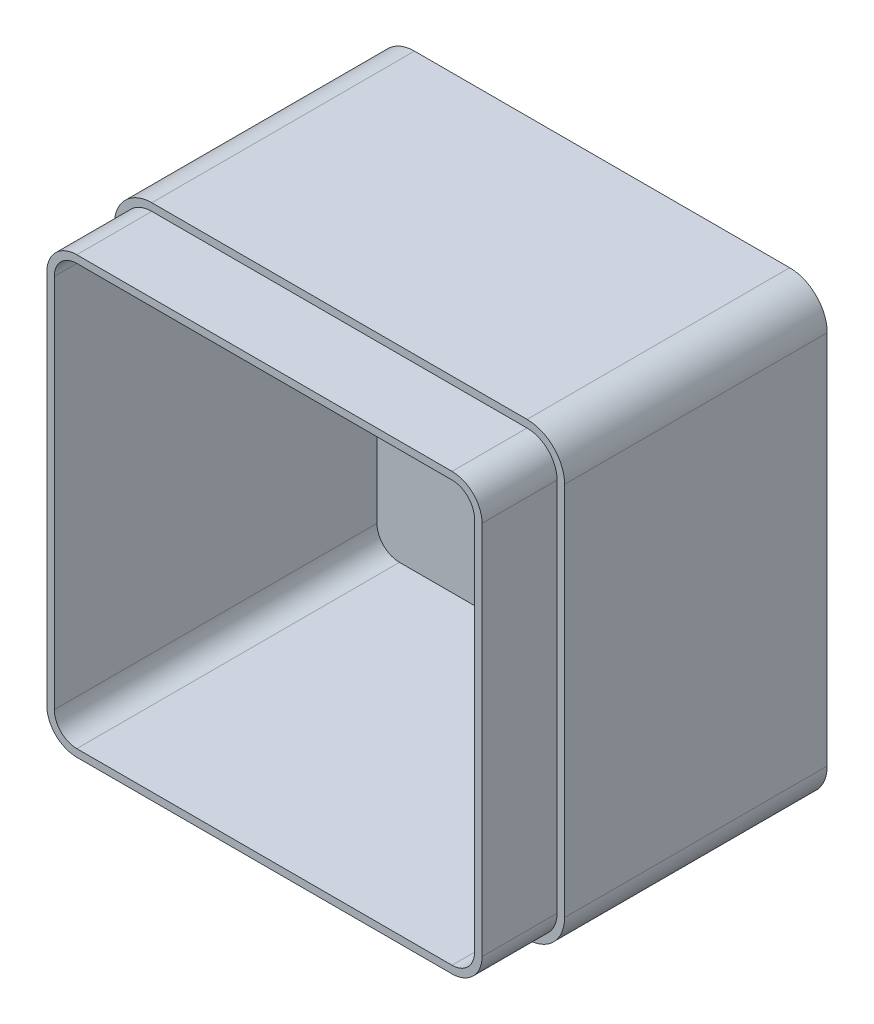
ISO-10303-21;
HEADER;
FILE_DESCRIPTION(('STEP AP214'),'2;1');
FILE_NAME('part.step','',(''),(''),'','','');
FILE_SCHEMA(('AUTOMOTIVE_DESIGN { 1 0 10303 214 1 1 1 1 }'));
ENDSEC;
DATA;
#1=APPLICATION_CONTEXT('core data for automotive mechanical design processes');
#2=APPLICATION_PROTOCOL_DEFINITION('international standard','automotive_design',2000,#1);
#3=PRODUCT_CONTEXT('',#1,'mechanical');
#4=PRODUCT('Part','Part','',(#3));
#5=PRODUCT_RELATED_PRODUCT_CATEGORY('part','',(#4));
#6=PRODUCT_DEFINITION_FORMATION('','',#4);
#7=PRODUCT_DEFINITION_CONTEXT('part definition',#1,'design');
#8=PRODUCT_DEFINITION('design','',#6,#7);
#9=PRODUCT_DEFINITION_SHAPE('','',#8);
#10=(LENGTH_UNIT() NAMED_UNIT(*) SI_UNIT(.MILLI.,.METRE.));
#11=(NAMED_UNIT(*) PLANE_ANGLE_UNIT() SI_UNIT($,.RADIAN.));
#12=(NAMED_UNIT(*) SI_UNIT($,.STERADIAN.) SOLID_ANGLE_UNIT());
#13=UNCERTAINTY_MEASURE_WITH_UNIT(LENGTH_MEASURE(1.E-05),#10,'distance_accuracy_value','');
#14=(GEOMETRIC_REPRESENTATION_CONTEXT(3) GLOBAL_UNCERTAINTY_ASSIGNED_CONTEXT((#13)) GLOBAL_UNIT_ASSIGNED_CONTEXT((#10,
#11,#12)) REPRESENTATION_CONTEXT('',''));
#15=CARTESIAN_POINT('',(0.,0.,0.));
#16=DIRECTION('',(0.,0.,1.));
#17=DIRECTION('',(1.,0.,0.));
#18=AXIS2_PLACEMENT_3D('',#15,#16,#17);
#19=CARTESIAN_POINT('',(0.,0.,90.));
#20=DIRECTION('',(0.,0.,-1.));
#21=DIRECTION('',(-1.,0.,0.));
#22=AXIS2_PLACEMENT_3D('',#19,#20,#21);
#23=PLANE('',#22);
#24=DIRECTION('',(0.,-1.,0.));
#25=VECTOR('',#24,1.);
#26=CARTESIAN_POINT('',(4.,0.,90.));
#27=LINE('',#26,#25);
#28=CARTESIAN_POINT('',(3.99999999999996,110.,90.));
#29=VERTEX_POINT('',#28);
#30=CARTESIAN_POINT('',(4.,10.,90.));
#31=VERTEX_POINT('',#30);
#32=EDGE_CURVE('E306',#29,#31,#27,.T.);
#33=ORIENTED_EDGE('',*,*,#32,.F.);
#34=CARTESIAN_POINT('',(9.99999999999996,110.,90.));
#35=DIRECTION('',(0.,0.,-1.));
#36=DIRECTION('',(-1.,0.,0.));
#37=AXIS2_PLACEMENT_3D('',#34,#35,#36);
#38=CIRCLE('',#37,6.);
#39=CARTESIAN_POINT('',(9.99999999999996,116.,90.));
#40=VERTEX_POINT('',#39);
#41=EDGE_CURVE('E289',#40,#29,#38,.F.);
#42=ORIENTED_EDGE('',*,*,#41,.F.);
#43=DIRECTION('',(-1.,0.,0.));
#44=VECTOR('',#43,1.);
#45=CARTESIAN_POINT('',(0.,116.,90.));
#46=LINE('',#45,#44);
#47=CARTESIAN_POINT('',(110.,116.,90.));
#48=VERTEX_POINT('',#47);
#49=EDGE_CURVE('E315',#48,#40,#46,.T.);
#50=ORIENTED_EDGE('',*,*,#49,.F.);
#51=CARTESIAN_POINT('',(110.,110.,90.));
#52=DIRECTION('',(0.,0.,-1.));
#53=DIRECTION('',(-1.,0.,0.));
#54=AXIS2_PLACEMENT_3D('',#51,#52,#53);
#55=CIRCLE('',#54,6.);
#56=CARTESIAN_POINT('',(116.,110.,90.));
#57=VERTEX_POINT('',#56);
#58=EDGE_CURVE('E338',#57,#48,#55,.F.);
#59=ORIENTED_EDGE('',*,*,#58,.F.);
#60=DIRECTION('',(0.,1.,0.));
#61=VECTOR('',#60,1.);
#62=CARTESIAN_POINT('',(116.,0.,90.));
#63=LINE('',#62,#61);
#64=CARTESIAN_POINT('',(116.,10.,90.));
#65=VERTEX_POINT('',#64);
#66=EDGE_CURVE('E336',#65,#57,#63,.T.);
#67=ORIENTED_EDGE('',*,*,#66,.F.);
#68=CARTESIAN_POINT('',(110.,10.,90.));
#69=DIRECTION('',(0.,0.,-1.));
#70=DIRECTION('',(-1.,0.,0.));
#71=AXIS2_PLACEMENT_3D('',#68,#69,#70);
#72=CIRCLE('',#71,6.);
#73=CARTESIAN_POINT('',(110.,4.,90.));
#74=VERTEX_POINT('',#73);
#75=EDGE_CURVE('E333',#74,#65,#72,.F.);
#76=ORIENTED_EDGE('',*,*,#75,.F.);
#77=DIRECTION('',(1.,0.,0.));
#78=VECTOR('',#77,1.);
#79=CARTESIAN_POINT('',(0.,4.,90.));
#80=LINE('',#79,#78);
#81=CARTESIAN_POINT('',(9.99999999999999,4.,90.));
#82=VERTEX_POINT('',#81);
#83=EDGE_CURVE('E331',#82,#74,#80,.T.);
#84=ORIENTED_EDGE('',*,*,#83,.F.);
#85=CARTESIAN_POINT('',(9.99999999999999,10.,90.));
#86=DIRECTION('',(0.,0.,-1.));
#87=DIRECTION('',(-1.,0.,0.));
#88=AXIS2_PLACEMENT_3D('',#85,#86,#87);
#89=CIRCLE('',#88,6.);
#90=EDGE_CURVE('E322',#31,#82,#89,.F.);
#91=ORIENTED_EDGE('',*,*,#90,.F.);
#92=EDGE_LOOP('',(#33,#42,#50,#59,#67,#76,#84,#91));
#93=FACE_BOUND('',#92,.T.);
#94=CARTESIAN_POINT('',(9.99999999999996,110.,90.));
#95=DIRECTION('',(0.,0.,1.));
#96=DIRECTION('',(1.,0.,0.));
#97=AXIS2_PLACEMENT_3D('',#94,#95,#96);
#98=CIRCLE('',#97,8.);
#99=CARTESIAN_POINT('',(9.99999999999995,118.,90.));
#100=VERTEX_POINT('',#99);
#101=CARTESIAN_POINT('',(1.99999999999996,110.,90.));
#102=VERTEX_POINT('',#101);
#103=EDGE_CURVE('E241',#100,#102,#98,.T.);
#104=ORIENTED_EDGE('',*,*,#103,.T.);
#105=DIRECTION('',(0.,-1.,0.));
#106=VECTOR('',#105,1.);
#107=CARTESIAN_POINT('',(1.99999999999996,110.,90.));
#108=LINE('',#107,#106);
#109=CARTESIAN_POINT('',(1.99999999999996,9.99999999999999,90.));
#110=VERTEX_POINT('',#109);
#111=EDGE_CURVE('E201',#102,#110,#108,.T.);
#112=ORIENTED_EDGE('',*,*,#111,.T.);
#113=CARTESIAN_POINT('',(9.99999999999999,10.,90.));
#114=DIRECTION('',(0.,0.,1.));
#115=DIRECTION('',(1.,0.,0.));
#116=AXIS2_PLACEMENT_3D('',#113,#114,#115);
#117=CIRCLE('',#116,8.00000000000001);
#118=CARTESIAN_POINT('',(9.99999999999999,1.99999999999998,90.));
#119=VERTEX_POINT('',#118);
#120=EDGE_CURVE('E50',#110,#119,#117,.T.);
#121=ORIENTED_EDGE('',*,*,#120,.T.);
#122=DIRECTION('',(1.,0.,0.));
#123=VECTOR('',#122,1.);
#124=CARTESIAN_POINT('',(9.99999999999999,2.,90.));
#125=LINE('',#124,#123);
#126=CARTESIAN_POINT('',(110.,2.,90.));
#127=VERTEX_POINT('',#126);
#128=EDGE_CURVE('E245',#119,#127,#125,.T.);
#129=ORIENTED_EDGE('',*,*,#128,.T.);
#130=CARTESIAN_POINT('',(110.,10.,90.));
#131=DIRECTION('',(0.,0.,1.));
#132=DIRECTION('',(1.,0.,0.));
#133=AXIS2_PLACEMENT_3D('',#130,#131,#132);
#134=CIRCLE('',#133,7.99999999999999);
#135=CARTESIAN_POINT('',(118.,10.,90.));
#136=VERTEX_POINT('',#135);
#137=EDGE_CURVE('E248',#127,#136,#134,.T.);
#138=ORIENTED_EDGE('',*,*,#137,.T.);
#139=DIRECTION('',(0.,1.,0.));
#140=VECTOR('',#139,1.);
#141=CARTESIAN_POINT('',(118.,9.99999999999999,90.));
#142=LINE('',#141,#140);
#143=CARTESIAN_POINT('',(118.,110.,90.));
#144=VERTEX_POINT('',#143);
#145=EDGE_CURVE('E251',#136,#144,#142,.T.);
#146=ORIENTED_EDGE('',*,*,#145,.T.);
#147=CARTESIAN_POINT('',(110.,110.,90.));
#148=DIRECTION('',(0.,0.,1.));
#149=DIRECTION('',(1.,0.,0.));
#150=AXIS2_PLACEMENT_3D('',#147,#148,#149);
#151=CIRCLE('',#150,8.00000000000001);
#152=CARTESIAN_POINT('',(110.,118.,90.));
#153=VERTEX_POINT('',#152);
#154=EDGE_CURVE('E224',#144,#153,#151,.T.);
#155=ORIENTED_EDGE('',*,*,#154,.T.);
#156=DIRECTION('',(-1.,0.,0.));
#157=VECTOR('',#156,1.);
#158=CARTESIAN_POINT('',(110.,118.,90.));
#159=LINE('',#158,#157);
#160=EDGE_CURVE('E221',#153,#100,#159,.T.);
#161=ORIENTED_EDGE('',*,*,#160,.T.);
#162=EDGE_LOOP('',(#104,#112,#121,#129,#138,#146,#155,#161));
#163=FACE_BOUND('',#162,.T.);
#164=ADVANCED_FACE('F35',(#93,#163),#23,.F.);
#165=CARTESIAN_POINT('',(4.,0.,90.));
#166=DIRECTION('',(1.,0.,0.));
#167=DIRECTION('',(0.,1.,0.));
#168=AXIS2_PLACEMENT_3D('',#165,#166,#167);
#169=PLANE('',#168);
#170=DIRECTION('',(0.,-1.,0.));
#171=VECTOR('',#170,1.);
#172=CARTESIAN_POINT('',(4.,0.,4.));
#173=LINE('',#172,#171);
#174=CARTESIAN_POINT('',(3.99999999999996,110.,4.));
#175=VERTEX_POINT('',#174);
#176=CARTESIAN_POINT('',(4.,10.,4.));
#177=VERTEX_POINT('',#176);
#178=EDGE_CURVE('E283',#175,#177,#173,.T.);
#179=ORIENTED_EDGE('',*,*,#178,.F.);
#180=DIRECTION('',(0.,0.,1.));
#181=VECTOR('',#180,1.);
#182=CARTESIAN_POINT('',(3.99999999999996,110.,90.));
#183=LINE('',#182,#181);
#184=EDGE_CURVE('E290',#29,#175,#183,.F.);
#185=ORIENTED_EDGE('',*,*,#184,.F.);
#186=ORIENTED_EDGE('',*,*,#32,.T.);
#187=DIRECTION('',(0.,0.,1.));
#188=VECTOR('',#187,1.);
#189=CARTESIAN_POINT('',(4.,10.,90.));
#190=LINE('',#189,#188);
#191=EDGE_CURVE('E287',#177,#31,#190,.T.);
#192=ORIENTED_EDGE('',*,*,#191,.F.);
#193=EDGE_LOOP('',(#179,#185,#186,#192));
#194=FACE_BOUND('',#193,.T.);
#195=ADVANCED_FACE('F428',(#194),#169,.T.);
#196=CARTESIAN_POINT('',(0.,4.,90.));
#197=DIRECTION('',(0.,1.,0.));
#198=DIRECTION('',(0.,0.,1.));
#199=AXIS2_PLACEMENT_3D('',#196,#197,#198);
#200=PLANE('',#199);
#201=ORIENTED_EDGE('',*,*,#83,.T.);
#202=DIRECTION('',(0.,0.,1.));
#203=VECTOR('',#202,1.);
#204=CARTESIAN_POINT('',(110.,4.,90.));
#205=LINE('',#204,#203);
#206=CARTESIAN_POINT('',(110.,4.,4.));
#207=VERTEX_POINT('',#206);
#208=EDGE_CURVE('E313',#207,#74,#205,.T.);
#209=ORIENTED_EDGE('',*,*,#208,.F.);
#210=DIRECTION('',(1.,0.,0.));
#211=VECTOR('',#210,1.);
#212=CARTESIAN_POINT('',(0.,4.,4.));
#213=LINE('',#212,#211);
#214=CARTESIAN_POINT('',(9.99999999999999,4.,4.));
#215=VERTEX_POINT('',#214);
#216=EDGE_CURVE('E286',#215,#207,#213,.T.);
#217=ORIENTED_EDGE('',*,*,#216,.F.);
#218=DIRECTION('',(0.,0.,1.));
#219=VECTOR('',#218,1.);
#220=CARTESIAN_POINT('',(9.99999999999999,4.,90.));
#221=LINE('',#220,#219);
#222=EDGE_CURVE('E302',#82,#215,#221,.F.);
#223=ORIENTED_EDGE('',*,*,#222,.F.);
#224=EDGE_LOOP('',(#201,#209,#217,#223));
#225=FACE_BOUND('',#224,.T.);
#226=ADVANCED_FACE('F433',(#225),#200,.T.);
#227=CARTESIAN_POINT('',(116.,0.,90.));
#228=DIRECTION('',(-1.,0.,0.));
#229=DIRECTION('',(0.,-1.,0.));
#230=AXIS2_PLACEMENT_3D('',#227,#228,#229);
#231=PLANE('',#230);
#232=ORIENTED_EDGE('',*,*,#66,.T.);
#233=DIRECTION('',(0.,0.,1.));
#234=VECTOR('',#233,1.);
#235=CARTESIAN_POINT('',(116.,110.,90.));
#236=LINE('',#235,#234);
#237=CARTESIAN_POINT('',(116.,110.,4.));
#238=VERTEX_POINT('',#237);
#239=EDGE_CURVE('E320',#238,#57,#236,.T.);
#240=ORIENTED_EDGE('',*,*,#239,.F.);
#241=DIRECTION('',(0.,1.,0.));
#242=VECTOR('',#241,1.);
#243=CARTESIAN_POINT('',(116.,0.,4.));
#244=LINE('',#243,#242);
#245=CARTESIAN_POINT('',(116.,10.,4.));
#246=VERTEX_POINT('',#245);
#247=EDGE_CURVE('E296',#246,#238,#244,.T.);
#248=ORIENTED_EDGE('',*,*,#247,.F.);
#249=DIRECTION('',(0.,0.,1.));
#250=VECTOR('',#249,1.);
#251=CARTESIAN_POINT('',(116.,10.,90.));
#252=LINE('',#251,#250);
#253=EDGE_CURVE('E316',#65,#246,#252,.F.);
#254=ORIENTED_EDGE('',*,*,#253,.F.);
#255=EDGE_LOOP('',(#232,#240,#248,#254));
#256=FACE_BOUND('',#255,.T.);
#257=ADVANCED_FACE('F462',(#256),#231,.T.);
#258=CARTESIAN_POINT('',(0.,116.,90.));
#259=DIRECTION('',(0.,-1.,0.));
#260=DIRECTION('',(0.,0.,-1.));
#261=AXIS2_PLACEMENT_3D('',#258,#259,#260);
#262=PLANE('',#261);
#263=ORIENTED_EDGE('',*,*,#49,.T.);
#264=DIRECTION('',(0.,0.,-1.));
#265=VECTOR('',#264,1.);
#266=CARTESIAN_POINT('',(9.99999999999996,116.,90.));
#267=LINE('',#266,#265);
#268=CARTESIAN_POINT('',(9.99999999999996,116.,4.));
#269=VERTEX_POINT('',#268);
#270=EDGE_CURVE('E319',#269,#40,#267,.F.);
#271=ORIENTED_EDGE('',*,*,#270,.F.);
#272=DIRECTION('',(-1.,0.,0.));
#273=VECTOR('',#272,1.);
#274=CARTESIAN_POINT('',(0.,116.,4.));
#275=LINE('',#274,#273);
#276=CARTESIAN_POINT('',(110.,116.,4.));
#277=VERTEX_POINT('',#276);
#278=EDGE_CURVE('E303',#277,#269,#275,.T.);
#279=ORIENTED_EDGE('',*,*,#278,.F.);
#280=DIRECTION('',(0.,0.,-1.));
#281=VECTOR('',#280,1.);
#282=CARTESIAN_POINT('',(110.,116.,90.));
#283=LINE('',#282,#281);
#284=EDGE_CURVE('E323',#48,#277,#283,.T.);
#285=ORIENTED_EDGE('',*,*,#284,.F.);
#286=EDGE_LOOP('',(#263,#271,#279,#285));
#287=FACE_BOUND('',#286,.T.);
#288=ADVANCED_FACE('F458',(#287),#262,.T.);
#289=CARTESIAN_POINT('',(0.,0.,4.));
#290=DIRECTION('',(0.,0.,-1.));
#291=DIRECTION('',(-1.,0.,0.));
#292=AXIS2_PLACEMENT_3D('',#289,#290,#291);
#293=PLANE('',#292);
#294=ORIENTED_EDGE('',*,*,#216,.T.);
#295=CARTESIAN_POINT('',(110.,10.,4.));
#296=DIRECTION('',(0.,0.,-1.));
#297=DIRECTION('',(-1.,0.,0.));
#298=AXIS2_PLACEMENT_3D('',#295,#296,#297);
#299=CIRCLE('',#298,6.);
#300=EDGE_CURVE('E298',#246,#207,#299,.T.);
#301=ORIENTED_EDGE('',*,*,#300,.F.);
#302=ORIENTED_EDGE('',*,*,#247,.T.);
#303=CARTESIAN_POINT('',(110.,110.,4.));
#304=DIRECTION('',(0.,0.,-1.));
#305=DIRECTION('',(-1.,0.,0.));
#306=AXIS2_PLACEMENT_3D('',#303,#304,#305);
#307=CIRCLE('',#306,6.);
#308=EDGE_CURVE('E301',#277,#238,#307,.T.);
#309=ORIENTED_EDGE('',*,*,#308,.F.);
#310=ORIENTED_EDGE('',*,*,#278,.T.);
#311=CARTESIAN_POINT('',(9.99999999999996,110.,4.));
#312=DIRECTION('',(0.,0.,-1.));
#313=DIRECTION('',(-1.,0.,0.));
#314=AXIS2_PLACEMENT_3D('',#311,#312,#313);
#315=CIRCLE('',#314,6.);
#316=EDGE_CURVE('E299',#175,#269,#315,.T.);
#317=ORIENTED_EDGE('',*,*,#316,.F.);
#318=ORIENTED_EDGE('',*,*,#178,.T.);
#319=CARTESIAN_POINT('',(9.99999999999999,10.,4.));
#320=DIRECTION('',(0.,0.,-1.));
#321=DIRECTION('',(-1.,0.,0.));
#322=AXIS2_PLACEMENT_3D('',#319,#320,#321);
#323=CIRCLE('',#322,6.);
#324=EDGE_CURVE('E293',#215,#177,#323,.T.);
#325=ORIENTED_EDGE('',*,*,#324,.F.);
#326=EDGE_LOOP('',(#294,#301,#302,#309,#310,#317,#318,#325));
#327=FACE_BOUND('',#326,.T.);
#328=ADVANCED_FACE('F454',(#327),#293,.F.);
#329=CARTESIAN_POINT('',(9.99999999999999,10.,90.));
#330=DIRECTION('',(0.,0.,-1.));
#331=DIRECTION('',(-1.,0.,0.));
#332=AXIS2_PLACEMENT_3D('',#329,#330,#331);
#333=CYLINDRICAL_SURFACE('',#332,6.);
#334=ORIENTED_EDGE('',*,*,#90,.T.);
#335=ORIENTED_EDGE('',*,*,#222,.T.);
#336=ORIENTED_EDGE('',*,*,#324,.T.);
#337=ORIENTED_EDGE('',*,*,#191,.T.);
#338=EDGE_LOOP('',(#334,#335,#336,#337));
#339=FACE_BOUND('',#338,.T.);
#340=ADVANCED_FACE('F450',(#339),#333,.F.);
#341=CARTESIAN_POINT('',(110.,10.,90.));
#342=DIRECTION('',(0.,0.,-1.));
#343=DIRECTION('',(-1.,0.,0.));
#344=AXIS2_PLACEMENT_3D('',#341,#342,#343);
#345=CYLINDRICAL_SURFACE('',#344,6.);
#346=ORIENTED_EDGE('',*,*,#75,.T.);
#347=ORIENTED_EDGE('',*,*,#253,.T.);
#348=ORIENTED_EDGE('',*,*,#300,.T.);
#349=ORIENTED_EDGE('',*,*,#208,.T.);
#350=EDGE_LOOP('',(#346,#347,#348,#349));
#351=FACE_BOUND('',#350,.T.);
#352=ADVANCED_FACE('F446',(#351),#345,.F.);
#353=CARTESIAN_POINT('',(110.,110.,90.));
#354=DIRECTION('',(0.,0.,-1.));
#355=DIRECTION('',(-1.,0.,0.));
#356=AXIS2_PLACEMENT_3D('',#353,#354,#355);
#357=CYLINDRICAL_SURFACE('',#356,6.);
#358=ORIENTED_EDGE('',*,*,#58,.T.);
#359=ORIENTED_EDGE('',*,*,#284,.T.);
#360=ORIENTED_EDGE('',*,*,#308,.T.);
#361=ORIENTED_EDGE('',*,*,#239,.T.);
#362=EDGE_LOOP('',(#358,#359,#360,#361));
#363=FACE_BOUND('',#362,.T.);
#364=ADVANCED_FACE('F442',(#363),#357,.F.);
#365=CARTESIAN_POINT('',(9.99999999999996,110.,90.));
#366=DIRECTION('',(0.,0.,-1.));
#367=DIRECTION('',(-1.,0.,0.));
#368=AXIS2_PLACEMENT_3D('',#365,#366,#367);
#369=CYLINDRICAL_SURFACE('',#368,6.);
#370=ORIENTED_EDGE('',*,*,#41,.T.);
#371=ORIENTED_EDGE('',*,*,#184,.T.);
#372=ORIENTED_EDGE('',*,*,#316,.T.);
#373=ORIENTED_EDGE('',*,*,#270,.T.);
#374=EDGE_LOOP('',(#370,#371,#372,#373));
#375=FACE_BOUND('',#374,.T.);
#376=ADVANCED_FACE('F439',(#375),#369,.F.);
#377=CARTESIAN_POINT('',(9.99999999999996,110.,70.));
#378=DIRECTION('',(0.,0.,1.));
#379=DIRECTION('',(1.,0.,0.));
#380=AXIS2_PLACEMENT_3D('',#377,#378,#379);
#381=PLANE('',#380);
#382=DIRECTION('',(-1.,0.,0.));
#383=VECTOR('',#382,1.);
#384=CARTESIAN_POINT('',(110.,118.,70.));
#385=LINE('',#384,#383);
#386=CARTESIAN_POINT('',(110.,118.,70.));
#387=VERTEX_POINT('',#386);
#388=CARTESIAN_POINT('',(9.99999999999995,118.,70.));
#389=VERTEX_POINT('',#388);
#390=EDGE_CURVE('E207',#387,#389,#385,.T.);
#391=ORIENTED_EDGE('',*,*,#390,.F.);
#392=CARTESIAN_POINT('',(110.,110.,70.));
#393=DIRECTION('',(0.,0.,1.));
#394=DIRECTION('',(1.,0.,0.));
#395=AXIS2_PLACEMENT_3D('',#392,#393,#394);
#396=CIRCLE('',#395,8.00000000000001);
#397=CARTESIAN_POINT('',(118.,110.,70.));
#398=VERTEX_POINT('',#397);
#399=EDGE_CURVE('E237',#398,#387,#396,.T.);
#400=ORIENTED_EDGE('',*,*,#399,.F.);
#401=DIRECTION('',(0.,1.,0.));
#402=VECTOR('',#401,1.);
#403=CARTESIAN_POINT('',(118.,9.99999999999999,70.));
#404=LINE('',#403,#402);
#405=CARTESIAN_POINT('',(118.,10.,70.));
#406=VERTEX_POINT('',#405);
#407=EDGE_CURVE('E234',#406,#398,#404,.T.);
#408=ORIENTED_EDGE('',*,*,#407,.F.);
#409=CARTESIAN_POINT('',(110.,10.,70.));
#410=DIRECTION('',(0.,0.,1.));
#411=DIRECTION('',(1.,0.,0.));
#412=AXIS2_PLACEMENT_3D('',#409,#410,#411);
#413=CIRCLE('',#412,7.99999999999999);
#414=CARTESIAN_POINT('',(110.,2.,70.));
#415=VERTEX_POINT('',#414);
#416=EDGE_CURVE('E231',#415,#406,#413,.T.);
#417=ORIENTED_EDGE('',*,*,#416,.F.);
#418=DIRECTION('',(1.,0.,0.));
#419=VECTOR('',#418,1.);
#420=CARTESIAN_POINT('',(9.99999999999999,2.,70.));
#421=LINE('',#420,#419);
#422=CARTESIAN_POINT('',(9.99999999999999,1.99999999999998,70.));
#423=VERTEX_POINT('',#422);
#424=EDGE_CURVE('E228',#423,#415,#421,.T.);
#425=ORIENTED_EDGE('',*,*,#424,.F.);
#426=CARTESIAN_POINT('',(9.99999999999999,10.,70.));
#427=DIRECTION('',(0.,0.,1.));
#428=DIRECTION('',(1.,0.,0.));
#429=AXIS2_PLACEMENT_3D('',#426,#427,#428);
#430=CIRCLE('',#429,8.00000000000001);
#431=CARTESIAN_POINT('',(1.99999999999996,9.99999999999999,70.));
#432=VERTEX_POINT('',#431);
#433=EDGE_CURVE('E217',#432,#423,#430,.T.);
#434=ORIENTED_EDGE('',*,*,#433,.F.);
#435=DIRECTION('',(0.,-1.,0.));
#436=VECTOR('',#435,1.);
#437=CARTESIAN_POINT('',(1.99999999999996,110.,70.));
#438=LINE('',#437,#436);
#439=CARTESIAN_POINT('',(1.99999999999996,110.,70.));
#440=VERTEX_POINT('',#439);
#441=EDGE_CURVE('E199',#440,#432,#438,.T.);
#442=ORIENTED_EDGE('',*,*,#441,.F.);
#443=CARTESIAN_POINT('',(9.99999999999996,110.,70.));
#444=DIRECTION('',(0.,0.,1.));
#445=DIRECTION('',(1.,0.,0.));
#446=AXIS2_PLACEMENT_3D('',#443,#444,#445);
#447=CIRCLE('',#446,8.);
#448=EDGE_CURVE('E213',#389,#440,#447,.T.);
#449=ORIENTED_EDGE('',*,*,#448,.F.);
#450=EDGE_LOOP('',(#391,#400,#408,#417,#425,#434,#442,#449));
#451=FACE_BOUND('',#450,.T.);
#452=CARTESIAN_POINT('',(9.99999999999996,110.,70.));
#453=DIRECTION('',(0.,0.,1.));
#454=DIRECTION('',(1.,0.,0.));
#455=AXIS2_PLACEMENT_3D('',#452,#453,#454);
#456=CIRCLE('',#455,10.);
#457=CARTESIAN_POINT('',(9.99999999999996,120.,70.));
#458=VERTEX_POINT('',#457);
#459=CARTESIAN_POINT('',(0.,110.,70.));
#460=VERTEX_POINT('',#459);
#461=EDGE_CURVE('E257',#458,#460,#456,.T.);
#462=ORIENTED_EDGE('',*,*,#461,.T.);
#463=DIRECTION('',(0.,-1.,0.));
#464=VECTOR('',#463,1.);
#465=CARTESIAN_POINT('',(0.,110.,70.));
#466=LINE('',#465,#464);
#467=CARTESIAN_POINT('',(0.,9.99999999999999,70.));
#468=VERTEX_POINT('',#467);
#469=EDGE_CURVE('E270',#460,#468,#466,.T.);
#470=ORIENTED_EDGE('',*,*,#469,.T.);
#471=CARTESIAN_POINT('',(9.99999999999999,10.,70.));
#472=DIRECTION('',(0.,0.,1.));
#473=DIRECTION('',(1.,0.,0.));
#474=AXIS2_PLACEMENT_3D('',#471,#472,#473);
#475=CIRCLE('',#474,10.);
#476=CARTESIAN_POINT('',(9.99999999999999,0.,70.));
#477=VERTEX_POINT('',#476);
#478=EDGE_CURVE('E272',#468,#477,#475,.T.);
#479=ORIENTED_EDGE('',*,*,#478,.T.);
#480=DIRECTION('',(1.,0.,0.));
#481=VECTOR('',#480,1.);
#482=CARTESIAN_POINT('',(9.99999999999999,0.,70.));
#483=LINE('',#482,#481);
#484=CARTESIAN_POINT('',(110.,0.,70.));
#485=VERTEX_POINT('',#484);
#486=EDGE_CURVE('E274',#477,#485,#483,.T.);
#487=ORIENTED_EDGE('',*,*,#486,.T.);
#488=CARTESIAN_POINT('',(110.,10.,70.));
#489=DIRECTION('',(0.,0.,1.));
#490=DIRECTION('',(1.,0.,0.));
#491=AXIS2_PLACEMENT_3D('',#488,#489,#490);
#492=CIRCLE('',#491,9.99999999999999);
#493=CARTESIAN_POINT('',(120.,10.,70.));
#494=VERTEX_POINT('',#493);
#495=EDGE_CURVE('E276',#485,#494,#492,.T.);
#496=ORIENTED_EDGE('',*,*,#495,.T.);
#497=DIRECTION('',(0.,1.,0.));
#498=VECTOR('',#497,1.);
#499=CARTESIAN_POINT('',(120.,10.,70.));
#500=LINE('',#499,#498);
#501=CARTESIAN_POINT('',(120.,110.,70.));
#502=VERTEX_POINT('',#501);
#503=EDGE_CURVE('E278',#494,#502,#500,.T.);
#504=ORIENTED_EDGE('',*,*,#503,.T.);
#505=CARTESIAN_POINT('',(110.,110.,70.));
#506=DIRECTION('',(0.,0.,1.));
#507=DIRECTION('',(1.,0.,0.));
#508=AXIS2_PLACEMENT_3D('',#505,#506,#507);
#509=CIRCLE('',#508,9.99999999999999);
#510=CARTESIAN_POINT('',(110.,120.,70.));
#511=VERTEX_POINT('',#510);
#512=EDGE_CURVE('E280',#502,#511,#509,.T.);
#513=ORIENTED_EDGE('',*,*,#512,.T.);
#514=DIRECTION('',(-1.,0.,0.));
#515=VECTOR('',#514,1.);
#516=CARTESIAN_POINT('',(110.,120.,70.));
#517=LINE('',#516,#515);
#518=EDGE_CURVE('E58',#511,#458,#517,.T.);
#519=ORIENTED_EDGE('',*,*,#518,.T.);
#520=EDGE_LOOP('',(#462,#470,#479,#487,#496,#504,#513,#519));
#521=FACE_BOUND('',#520,.T.);
#522=ADVANCED_FACE('F212',(#451,#521),#381,.T.);
#523=CARTESIAN_POINT('',(9.99999999999996,110.,70.));
#524=DIRECTION('',(0.,0.,1.));
#525=DIRECTION('',(1.,0.,0.));
#526=AXIS2_PLACEMENT_3D('',#523,#524,#525);
#527=CYLINDRICAL_SURFACE('',#526,8.);
#528=ORIENTED_EDGE('',*,*,#103,.F.);
#529=DIRECTION('',(0.,0.,1.));
#530=VECTOR('',#529,1.);
#531=CARTESIAN_POINT('',(9.99999999999995,118.,70.));
#532=LINE('',#531,#530);
#533=EDGE_CURVE('E220',#389,#100,#532,.T.);
#534=ORIENTED_EDGE('',*,*,#533,.F.);
#535=ORIENTED_EDGE('',*,*,#448,.T.);
#536=DIRECTION('',(0.,0.,1.));
#537=VECTOR('',#536,1.);
#538=CARTESIAN_POINT('',(1.99999999999996,110.,70.));
#539=LINE('',#538,#537);
#540=EDGE_CURVE('E196',#440,#102,#539,.T.);
#541=ORIENTED_EDGE('',*,*,#540,.T.);
#542=EDGE_LOOP('',(#528,#534,#535,#541));
#543=FACE_BOUND('',#542,.T.);
#544=ADVANCED_FACE('F219',(#543),#527,.T.);
#545=CARTESIAN_POINT('',(110.,118.,70.));
#546=DIRECTION('',(0.,1.,0.));
#547=DIRECTION('',(0.,0.,1.));
#548=AXIS2_PLACEMENT_3D('',#545,#546,#547);
#549=PLANE('',#548);
#550=ORIENTED_EDGE('',*,*,#160,.F.);
#551=DIRECTION('',(0.,0.,1.));
#552=VECTOR('',#551,1.);
#553=CARTESIAN_POINT('',(110.,118.,70.));
#554=LINE('',#553,#552);
#555=EDGE_CURVE('E258',#387,#153,#554,.T.);
#556=ORIENTED_EDGE('',*,*,#555,.F.);
#557=ORIENTED_EDGE('',*,*,#390,.T.);
#558=ORIENTED_EDGE('',*,*,#533,.T.);
#559=EDGE_LOOP('',(#550,#556,#557,#558));
#560=FACE_BOUND('',#559,.T.);
#561=ADVANCED_FACE('F473',(#560),#549,.T.);
#562=CARTESIAN_POINT('',(110.,110.,70.));
#563=DIRECTION('',(0.,0.,1.));
#564=DIRECTION('',(1.,0.,0.));
#565=AXIS2_PLACEMENT_3D('',#562,#563,#564);
#566=CYLINDRICAL_SURFACE('',#565,8.00000000000001);
#567=ORIENTED_EDGE('',*,*,#154,.F.);
#568=DIRECTION('',(0.,0.,1.));
#569=VECTOR('',#568,1.);
#570=CARTESIAN_POINT('',(118.,110.,70.));
#571=LINE('',#570,#569);
#572=EDGE_CURVE('E260',#398,#144,#571,.T.);
#573=ORIENTED_EDGE('',*,*,#572,.F.);
#574=ORIENTED_EDGE('',*,*,#399,.T.);
#575=ORIENTED_EDGE('',*,*,#555,.T.);
#576=EDGE_LOOP('',(#567,#573,#574,#575));
#577=FACE_BOUND('',#576,.T.);
#578=ADVANCED_FACE('F488',(#577),#566,.T.);
#579=CARTESIAN_POINT('',(118.,9.99999999999999,70.));
#580=DIRECTION('',(1.,0.,0.));
#581=DIRECTION('',(0.,0.,-1.));
#582=AXIS2_PLACEMENT_3D('',#579,#580,#581);
#583=PLANE('',#582);
#584=ORIENTED_EDGE('',*,*,#145,.F.);
#585=DIRECTION('',(0.,0.,1.));
#586=VECTOR('',#585,1.);
#587=CARTESIAN_POINT('',(118.,10.,70.));
#588=LINE('',#587,#586);
#589=EDGE_CURVE('E262',#406,#136,#588,.T.);
#590=ORIENTED_EDGE('',*,*,#589,.F.);
#591=ORIENTED_EDGE('',*,*,#407,.T.);
#592=ORIENTED_EDGE('',*,*,#572,.T.);
#593=EDGE_LOOP('',(#584,#590,#591,#592));
#594=FACE_BOUND('',#593,.T.);
#595=ADVANCED_FACE('F484',(#594),#583,.T.);
#596=CARTESIAN_POINT('',(110.,10.,70.));
#597=DIRECTION('',(0.,0.,1.));
#598=DIRECTION('',(1.,0.,0.));
#599=AXIS2_PLACEMENT_3D('',#596,#597,#598);
#600=CYLINDRICAL_SURFACE('',#599,7.99999999999999);
#601=ORIENTED_EDGE('',*,*,#137,.F.);
#602=DIRECTION('',(0.,0.,1.));
#603=VECTOR('',#602,1.);
#604=CARTESIAN_POINT('',(110.,2.,70.));
#605=LINE('',#604,#603);
#606=EDGE_CURVE('E264',#415,#127,#605,.T.);
#607=ORIENTED_EDGE('',*,*,#606,.F.);
#608=ORIENTED_EDGE('',*,*,#416,.T.);
#609=ORIENTED_EDGE('',*,*,#589,.T.);
#610=EDGE_LOOP('',(#601,#607,#608,#609));
#611=FACE_BOUND('',#610,.T.);
#612=ADVANCED_FACE('F480',(#611),#600,.T.);
#613=CARTESIAN_POINT('',(9.99999999999999,2.,70.));
#614=DIRECTION('',(0.,-1.,0.));
#615=DIRECTION('',(0.,0.,-1.));
#616=AXIS2_PLACEMENT_3D('',#613,#614,#615);
#617=PLANE('',#616);
#618=ORIENTED_EDGE('',*,*,#128,.F.);
#619=DIRECTION('',(0.,0.,1.));
#620=VECTOR('',#619,1.);
#621=CARTESIAN_POINT('',(9.99999999999999,1.99999999999998,70.));
#622=LINE('',#621,#620);
#623=EDGE_CURVE('E266',#423,#119,#622,.T.);
#624=ORIENTED_EDGE('',*,*,#623,.F.);
#625=ORIENTED_EDGE('',*,*,#424,.T.);
#626=ORIENTED_EDGE('',*,*,#606,.T.);
#627=EDGE_LOOP('',(#618,#624,#625,#626));
#628=FACE_BOUND('',#627,.T.);
#629=ADVANCED_FACE('F477',(#628),#617,.T.);
#630=CARTESIAN_POINT('',(9.99999999999999,10.,70.));
#631=DIRECTION('',(0.,0.,1.));
#632=DIRECTION('',(1.,0.,0.));
#633=AXIS2_PLACEMENT_3D('',#630,#631,#632);
#634=CYLINDRICAL_SURFACE('',#633,8.00000000000001);
#635=ORIENTED_EDGE('',*,*,#120,.F.);
#636=DIRECTION('',(0.,0.,1.));
#637=VECTOR('',#636,1.);
#638=CARTESIAN_POINT('',(1.99999999999996,9.99999999999999,70.));
#639=LINE('',#638,#637);
#640=EDGE_CURVE('E206',#432,#110,#639,.T.);
#641=ORIENTED_EDGE('',*,*,#640,.F.);
#642=ORIENTED_EDGE('',*,*,#433,.T.);
#643=ORIENTED_EDGE('',*,*,#623,.T.);
#644=EDGE_LOOP('',(#635,#641,#642,#643));
#645=FACE_BOUND('',#644,.T.);
#646=ADVANCED_FACE('F423',(#645),#634,.T.);
#647=CARTESIAN_POINT('',(1.99999999999996,110.,70.));
#648=DIRECTION('',(-1.,0.,0.));
#649=DIRECTION('',(0.,0.,1.));
#650=AXIS2_PLACEMENT_3D('',#647,#648,#649);
#651=PLANE('',#650);
#652=ORIENTED_EDGE('',*,*,#111,.F.);
#653=ORIENTED_EDGE('',*,*,#540,.F.);
#654=ORIENTED_EDGE('',*,*,#441,.T.);
#655=ORIENTED_EDGE('',*,*,#640,.T.);
#656=EDGE_LOOP('',(#652,#653,#654,#655));
#657=FACE_BOUND('',#656,.T.);
#658=ADVANCED_FACE('F198',(#657),#651,.T.);
#659=CARTESIAN_POINT('',(0.,0.,0.));
#660=DIRECTION('',(0.,0.,-1.));
#661=DIRECTION('',(-1.,0.,0.));
#662=AXIS2_PLACEMENT_3D('',#659,#660,#661);
#663=PLANE('',#662);
#664=DIRECTION('',(1.,0.,0.));
#665=VECTOR('',#664,1.);
#666=CARTESIAN_POINT('',(0.,0.,0.));
#667=LINE('',#666,#665);
#668=CARTESIAN_POINT('',(9.99999999999999,0.,0.));
#669=VERTEX_POINT('',#668);
#670=CARTESIAN_POINT('',(110.,0.,0.));
#671=VERTEX_POINT('',#670);
#672=EDGE_CURVE('E346',#669,#671,#667,.T.);
#673=ORIENTED_EDGE('',*,*,#672,.F.);
#674=CARTESIAN_POINT('',(9.99999999999999,10.,0.));
#675=DIRECTION('',(0.,0.,-1.));
#676=DIRECTION('',(-1.,0.,0.));
#677=AXIS2_PLACEMENT_3D('',#674,#675,#676);
#678=CIRCLE('',#677,10.);
#679=CARTESIAN_POINT('',(0.,9.99999999999999,0.));
#680=VERTEX_POINT('',#679);
#681=EDGE_CURVE('E366',#669,#680,#678,.T.);
#682=ORIENTED_EDGE('',*,*,#681,.T.);
#683=DIRECTION('',(0.,-1.,0.));
#684=VECTOR('',#683,1.);
#685=CARTESIAN_POINT('',(0.,0.,0.));
#686=LINE('',#685,#684);
#687=CARTESIAN_POINT('',(0.,110.,0.));
#688=VERTEX_POINT('',#687);
#689=EDGE_CURVE('E326',#688,#680,#686,.T.);
#690=ORIENTED_EDGE('',*,*,#689,.F.);
#691=CARTESIAN_POINT('',(9.99999999999996,110.,0.));
#692=DIRECTION('',(0.,0.,-1.));
#693=DIRECTION('',(-1.,0.,0.));
#694=AXIS2_PLACEMENT_3D('',#691,#692,#693);
#695=CIRCLE('',#694,10.);
#696=CARTESIAN_POINT('',(9.99999999999996,120.,0.));
#697=VERTEX_POINT('',#696);
#698=EDGE_CURVE('E360',#688,#697,#695,.T.);
#699=ORIENTED_EDGE('',*,*,#698,.T.);
#700=DIRECTION('',(-1.,0.,0.));
#701=VECTOR('',#700,1.);
#702=CARTESIAN_POINT('',(0.,120.,0.));
#703=LINE('',#702,#701);
#704=CARTESIAN_POINT('',(110.,120.,0.));
#705=VERTEX_POINT('',#704);
#706=EDGE_CURVE('E352',#705,#697,#703,.T.);
#707=ORIENTED_EDGE('',*,*,#706,.F.);
#708=CARTESIAN_POINT('',(110.,110.,0.));
#709=DIRECTION('',(0.,0.,-1.));
#710=DIRECTION('',(-1.,0.,0.));
#711=AXIS2_PLACEMENT_3D('',#708,#709,#710);
#712=CIRCLE('',#711,10.);
#713=CARTESIAN_POINT('',(120.,110.,0.));
#714=VERTEX_POINT('',#713);
#715=EDGE_CURVE('E362',#705,#714,#712,.T.);
#716=ORIENTED_EDGE('',*,*,#715,.T.);
#717=DIRECTION('',(0.,1.,0.));
#718=VECTOR('',#717,1.);
#719=CARTESIAN_POINT('',(120.,0.,0.));
#720=LINE('',#719,#718);
#721=CARTESIAN_POINT('',(120.,10.,0.));
#722=VERTEX_POINT('',#721);
#723=EDGE_CURVE('E349',#722,#714,#720,.T.);
#724=ORIENTED_EDGE('',*,*,#723,.F.);
#725=CARTESIAN_POINT('',(110.,10.,0.));
#726=DIRECTION('',(0.,0.,-1.));
#727=DIRECTION('',(-1.,0.,0.));
#728=AXIS2_PLACEMENT_3D('',#725,#726,#727);
#729=CIRCLE('',#728,10.);
#730=EDGE_CURVE('E364',#722,#671,#729,.T.);
#731=ORIENTED_EDGE('',*,*,#730,.T.);
#732=EDGE_LOOP('',(#673,#682,#690,#699,#707,#716,#724,#731));
#733=FACE_BOUND('',#732,.T.);
#734=ADVANCED_FACE('F416',(#733),#663,.T.);
#735=CARTESIAN_POINT('',(9.99999999999996,110.,90.));
#736=DIRECTION('',(0.,0.,-1.));
#737=DIRECTION('',(-1.,0.,0.));
#738=AXIS2_PLACEMENT_3D('',#735,#736,#737);
#739=CYLINDRICAL_SURFACE('',#738,10.);
#740=DIRECTION('',(0.,0.,-1.));
#741=VECTOR('',#740,1.);
#742=CARTESIAN_POINT('',(0.,110.,90.));
#743=LINE('',#742,#741);
#744=EDGE_CURVE('E368',#460,#688,#743,.T.);
#745=ORIENTED_EDGE('',*,*,#744,.F.);
#746=ORIENTED_EDGE('',*,*,#461,.F.);
#747=DIRECTION('',(0.,0.,-1.));
#748=VECTOR('',#747,1.);
#749=CARTESIAN_POINT('',(9.99999999999996,120.,90.));
#750=LINE('',#749,#748);
#751=EDGE_CURVE('E43',#697,#458,#750,.F.);
#752=ORIENTED_EDGE('',*,*,#751,.F.);
#753=ORIENTED_EDGE('',*,*,#698,.F.);
#754=EDGE_LOOP('',(#745,#746,#752,#753));
#755=FACE_BOUND('',#754,.T.);
#756=ADVANCED_FACE('F37',(#755),#739,.T.);
#757=CARTESIAN_POINT('',(110.,110.,90.));
#758=DIRECTION('',(0.,0.,-1.));
#759=DIRECTION('',(-1.,0.,0.));
#760=AXIS2_PLACEMENT_3D('',#757,#758,#759);
#761=CYLINDRICAL_SURFACE('',#760,10.);
#762=DIRECTION('',(0.,0.,-1.));
#763=VECTOR('',#762,1.);
#764=CARTESIAN_POINT('',(110.,120.,90.));
#765=LINE('',#764,#763);
#766=EDGE_CURVE('E11',#511,#705,#765,.T.);
#767=ORIENTED_EDGE('',*,*,#766,.F.);
#768=ORIENTED_EDGE('',*,*,#512,.F.);
#769=DIRECTION('',(0.,0.,-1.));
#770=VECTOR('',#769,1.);
#771=CARTESIAN_POINT('',(120.,110.,90.));
#772=LINE('',#771,#770);
#773=EDGE_CURVE('E373',#714,#502,#772,.F.);
#774=ORIENTED_EDGE('',*,*,#773,.F.);
#775=ORIENTED_EDGE('',*,*,#715,.F.);
#776=EDGE_LOOP('',(#767,#768,#774,#775));
#777=FACE_BOUND('',#776,.T.);
#778=ADVANCED_FACE('F414',(#777),#761,.T.);
#779=CARTESIAN_POINT('',(0.,120.,90.));
#780=DIRECTION('',(0.,-1.,0.));
#781=DIRECTION('',(0.,0.,-1.));
#782=AXIS2_PLACEMENT_3D('',#779,#780,#781);
#783=PLANE('',#782);
#784=ORIENTED_EDGE('',*,*,#518,.F.);
#785=ORIENTED_EDGE('',*,*,#766,.T.);
#786=ORIENTED_EDGE('',*,*,#706,.T.);
#787=ORIENTED_EDGE('',*,*,#751,.T.);
#788=EDGE_LOOP('',(#784,#785,#786,#787));
#789=FACE_BOUND('',#788,.T.);
#790=ADVANCED_FACE('F380',(#789),#783,.F.);
#791=CARTESIAN_POINT('',(110.,10.,90.));
#792=DIRECTION('',(0.,0.,-1.));
#793=DIRECTION('',(-1.,0.,0.));
#794=AXIS2_PLACEMENT_3D('',#791,#792,#793);
#795=CYLINDRICAL_SURFACE('',#794,10.);
#796=DIRECTION('',(0.,0.,-1.));
#797=VECTOR('',#796,1.);
#798=CARTESIAN_POINT('',(120.,10.,90.));
#799=LINE('',#798,#797);
#800=EDGE_CURVE('E376',#494,#722,#799,.T.);
#801=ORIENTED_EDGE('',*,*,#800,.F.);
#802=ORIENTED_EDGE('',*,*,#495,.F.);
#803=DIRECTION('',(0.,0.,-1.));
#804=VECTOR('',#803,1.);
#805=CARTESIAN_POINT('',(110.,0.,90.));
#806=LINE('',#805,#804);
#807=EDGE_CURVE('E355',#671,#485,#806,.F.);
#808=ORIENTED_EDGE('',*,*,#807,.F.);
#809=ORIENTED_EDGE('',*,*,#730,.F.);
#810=EDGE_LOOP('',(#801,#802,#808,#809));
#811=FACE_BOUND('',#810,.T.);
#812=ADVANCED_FACE('F405',(#811),#795,.T.);
#813=CARTESIAN_POINT('',(120.,0.,90.));
#814=DIRECTION('',(-1.,0.,0.));
#815=DIRECTION('',(0.,-1.,0.));
#816=AXIS2_PLACEMENT_3D('',#813,#814,#815);
#817=PLANE('',#816);
#818=ORIENTED_EDGE('',*,*,#503,.F.);
#819=ORIENTED_EDGE('',*,*,#800,.T.);
#820=ORIENTED_EDGE('',*,*,#723,.T.);
#821=ORIENTED_EDGE('',*,*,#773,.T.);
#822=EDGE_LOOP('',(#818,#819,#820,#821));
#823=FACE_BOUND('',#822,.T.);
#824=ADVANCED_FACE('F410',(#823),#817,.F.);
#825=CARTESIAN_POINT('',(9.99999999999999,10.,90.));
#826=DIRECTION('',(0.,0.,-1.));
#827=DIRECTION('',(-1.,0.,0.));
#828=AXIS2_PLACEMENT_3D('',#825,#826,#827);
#829=CYLINDRICAL_SURFACE('',#828,10.);
#830=DIRECTION('',(0.,0.,-1.));
#831=VECTOR('',#830,1.);
#832=CARTESIAN_POINT('',(9.99999999999999,0.,90.));
#833=LINE('',#832,#831);
#834=EDGE_CURVE('E358',#477,#669,#833,.T.);
#835=ORIENTED_EDGE('',*,*,#834,.F.);
#836=ORIENTED_EDGE('',*,*,#478,.F.);
#837=DIRECTION('',(0.,0.,-1.));
#838=VECTOR('',#837,1.);
#839=CARTESIAN_POINT('',(0.,9.99999999999999,90.));
#840=LINE('',#839,#838);
#841=EDGE_CURVE('E370',#680,#468,#840,.F.);
#842=ORIENTED_EDGE('',*,*,#841,.F.);
#843=ORIENTED_EDGE('',*,*,#681,.F.);
#844=EDGE_LOOP('',(#835,#836,#842,#843));
#845=FACE_BOUND('',#844,.T.);
#846=ADVANCED_FACE('F395',(#845),#829,.T.);
#847=CARTESIAN_POINT('',(0.,0.,90.));
#848=DIRECTION('',(0.,1.,0.));
#849=DIRECTION('',(0.,0.,1.));
#850=AXIS2_PLACEMENT_3D('',#847,#848,#849);
#851=PLANE('',#850);
#852=ORIENTED_EDGE('',*,*,#486,.F.);
#853=ORIENTED_EDGE('',*,*,#834,.T.);
#854=ORIENTED_EDGE('',*,*,#672,.T.);
#855=ORIENTED_EDGE('',*,*,#807,.T.);
#856=EDGE_LOOP('',(#852,#853,#854,#855));
#857=FACE_BOUND('',#856,.T.);
#858=ADVANCED_FACE('F400',(#857),#851,.F.);
#859=CARTESIAN_POINT('',(0.,0.,90.));
#860=DIRECTION('',(1.,0.,0.));
#861=DIRECTION('',(0.,1.,0.));
#862=AXIS2_PLACEMENT_3D('',#859,#860,#861);
#863=PLANE('',#862);
#864=ORIENTED_EDGE('',*,*,#469,.F.);
#865=ORIENTED_EDGE('',*,*,#744,.T.);
#866=ORIENTED_EDGE('',*,*,#689,.T.);
#867=ORIENTED_EDGE('',*,*,#841,.T.);
#868=EDGE_LOOP('',(#864,#865,#866,#867));
#869=FACE_BOUND('',#868,.T.);
#870=ADVANCED_FACE('F390',(#869),#863,.F.);
#871=CLOSED_SHELL('',(#164,#195,#226,#257,#288,#328,#340,#352,#364,#376,#522,#544,#561,#578,
#595,#612,#629,#646,#658,#734,#756,#778,#790,#812,#824,#846,#858,#870));
#872=MANIFOLD_SOLID_BREP('B2',#871);
#873=ADVANCED_BREP_SHAPE_REPRESENTATION('',(#18,#872),#14);
#874=SHAPE_DEFINITION_REPRESENTATION(#9,#873);
ENDSEC;
END-ISO-10303-21;
